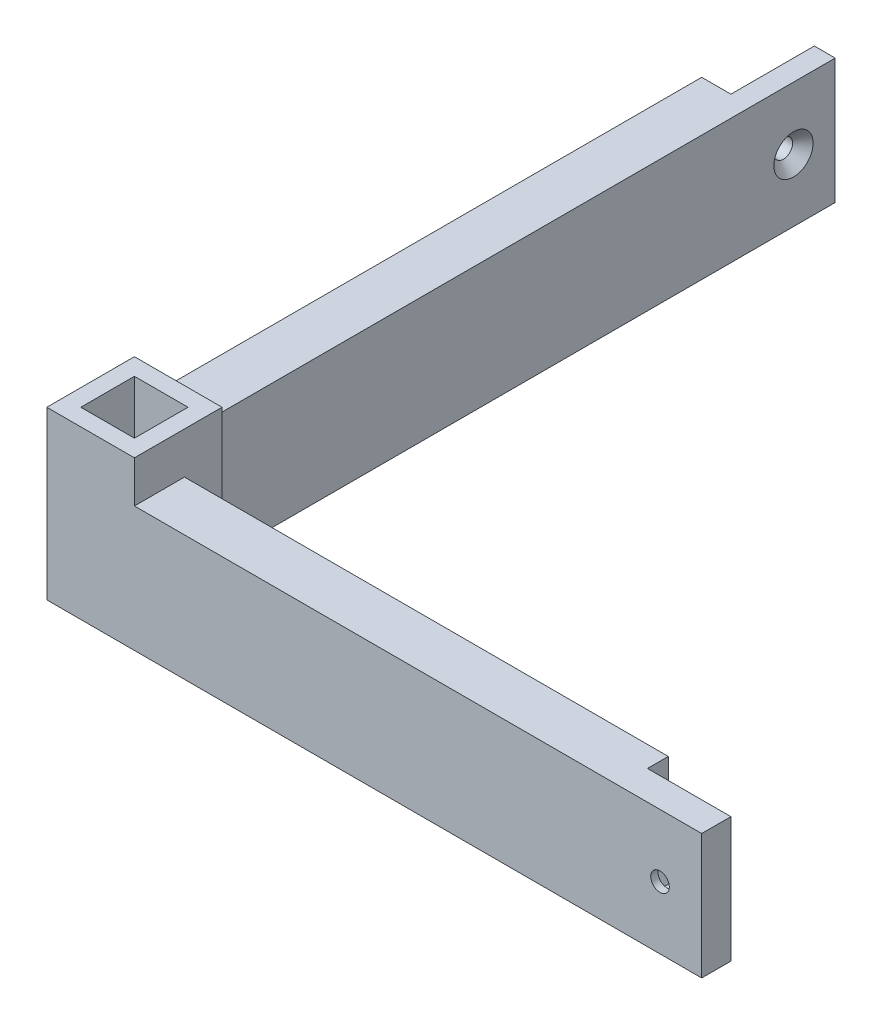
ISO-10303-21;
HEADER;
FILE_DESCRIPTION(('STEP AP214'),'2;1');
FILE_NAME('part.step','',(''),(''),'','','');
FILE_SCHEMA(('AUTOMOTIVE_DESIGN { 1 0 10303 214 1 1 1 1 }'));
ENDSEC;
DATA;
#1=APPLICATION_CONTEXT('core data for automotive mechanical design processes');
#2=APPLICATION_PROTOCOL_DEFINITION('international standard','automotive_design',2000,#1);
#3=PRODUCT_CONTEXT('',#1,'mechanical');
#4=PRODUCT('Part','Part','',(#3));
#5=PRODUCT_RELATED_PRODUCT_CATEGORY('part','',(#4));
#6=PRODUCT_DEFINITION_FORMATION('','',#4);
#7=PRODUCT_DEFINITION_CONTEXT('part definition',#1,'design');
#8=PRODUCT_DEFINITION('design','',#6,#7);
#9=PRODUCT_DEFINITION_SHAPE('','',#8);
#10=(LENGTH_UNIT() NAMED_UNIT(*) SI_UNIT(.MILLI.,.METRE.));
#11=(NAMED_UNIT(*) PLANE_ANGLE_UNIT() SI_UNIT($,.RADIAN.));
#12=(NAMED_UNIT(*) SI_UNIT($,.STERADIAN.) SOLID_ANGLE_UNIT());
#13=UNCERTAINTY_MEASURE_WITH_UNIT(LENGTH_MEASURE(1.E-05),#10,'distance_accuracy_value','');
#14=(GEOMETRIC_REPRESENTATION_CONTEXT(3) GLOBAL_UNCERTAINTY_ASSIGNED_CONTEXT((#13)) GLOBAL_UNIT_ASSIGNED_CONTEXT((#10,
#11,#12)) REPRESENTATION_CONTEXT('',''));
#15=CARTESIAN_POINT('',(0.,0.,0.));
#16=DIRECTION('',(0.,0.,1.));
#17=DIRECTION('',(1.,0.,0.));
#18=AXIS2_PLACEMENT_3D('',#15,#16,#17);
#19=CARTESIAN_POINT('',(21.,23.9944690265487,-13.3513274336283));
#20=DIRECTION('',(0.,0.,1.));
#21=DIRECTION('',(0.,-1.,0.));
#22=AXIS2_PLACEMENT_3D('',#19,#20,#21);
#23=PLANE('',#22);
#24=DIRECTION('',(-1.,0.,0.));
#25=VECTOR('',#24,1.);
#26=CARTESIAN_POINT('',(12.,-8.00553097345133,-13.3513274336283));
#27=LINE('',#26,#25);
#28=CARTESIAN_POINT('',(21.,-8.00553097345133,-13.3513274336283));
#29=VERTEX_POINT('',#28);
#30=CARTESIAN_POINT('',(12.,-8.00553097345133,-13.3513274336283));
#31=VERTEX_POINT('',#30);
#32=EDGE_CURVE('E264',#29,#31,#27,.T.);
#33=ORIENTED_EDGE('',*,*,#32,.T.);
#34=DIRECTION('',(0.,-1.,0.));
#35=VECTOR('',#34,1.);
#36=CARTESIAN_POINT('',(12.,-16.0055309734513,-13.3513274336283));
#37=LINE('',#36,#35);
#38=CARTESIAN_POINT('',(12.,13.9944690265487,-13.3513274336283));
#39=VERTEX_POINT('',#38);
#40=EDGE_CURVE('E435',#39,#31,#37,.T.);
#41=ORIENTED_EDGE('',*,*,#40,.F.);
#42=DIRECTION('',(1.,0.,0.));
#43=VECTOR('',#42,1.);
#44=CARTESIAN_POINT('',(0.,13.9944690265487,-13.3513274336283));
#45=LINE('',#44,#43);
#46=CARTESIAN_POINT('',(0.,13.9944690265487,-13.3513274336283));
#47=VERTEX_POINT('',#46);
#48=EDGE_CURVE('E430',#47,#39,#45,.T.);
#49=ORIENTED_EDGE('',*,*,#48,.F.);
#50=DIRECTION('',(0.,1.,0.));
#51=VECTOR('',#50,1.);
#52=CARTESIAN_POINT('',(0.,23.9944690265487,-13.3513274336283));
#53=LINE('',#52,#51);
#54=CARTESIAN_POINT('',(0.,23.9944690265487,-13.3513274336283));
#55=VERTEX_POINT('',#54);
#56=EDGE_CURVE('E522',#47,#55,#53,.T.);
#57=ORIENTED_EDGE('',*,*,#56,.T.);
#58=DIRECTION('',(-1.,0.,0.));
#59=VECTOR('',#58,1.);
#60=CARTESIAN_POINT('',(21.,23.9944690265487,-13.3513274336283));
#61=LINE('',#60,#59);
#62=CARTESIAN_POINT('',(21.,23.9944690265487,-13.3513274336283));
#63=VERTEX_POINT('',#62);
#64=EDGE_CURVE('E57',#63,#55,#61,.T.);
#65=ORIENTED_EDGE('',*,*,#64,.F.);
#66=DIRECTION('',(0.,1.,0.));
#67=VECTOR('',#66,1.);
#68=CARTESIAN_POINT('',(21.,23.9944690265487,-13.3513274336283));
#69=LINE('',#68,#67);
#70=EDGE_CURVE('E507',#29,#63,#69,.T.);
#71=ORIENTED_EDGE('',*,*,#70,.F.);
#72=EDGE_LOOP('',(#33,#41,#49,#57,#65,#71));
#73=FACE_BOUND('',#72,.T.);
#74=ADVANCED_FACE('F47',(#73),#23,.F.);
#75=CARTESIAN_POINT('',(0.,0.,0.));
#76=DIRECTION('',(1.,0.,0.));
#77=DIRECTION('',(0.,0.,-1.));
#78=AXIS2_PLACEMENT_3D('',#75,#76,#77);
#79=PLANE('',#78);
#80=DIRECTION('',(0.,1.,0.));
#81=VECTOR('',#80,1.);
#82=CARTESIAN_POINT('',(0.,13.9944690265487,-149.351327433628));
#83=LINE('',#82,#81);
#84=CARTESIAN_POINT('',(0.,-16.0055309734513,-149.351327433628));
#85=VERTEX_POINT('',#84);
#86=CARTESIAN_POINT('',(0.,13.9944690265487,-149.351327433628));
#87=VERTEX_POINT('',#86);
#88=EDGE_CURVE('E383',#85,#87,#83,.T.);
#89=ORIENTED_EDGE('',*,*,#88,.F.);
#90=DIRECTION('',(0.,0.,-1.));
#91=VECTOR('',#90,1.);
#92=CARTESIAN_POINT('',(0.,-16.0055309734513,7.64867256637168));
#93=LINE('',#92,#91);
#94=CARTESIAN_POINT('',(0.,-16.0055309734513,7.64867256637168));
#95=VERTEX_POINT('',#94);
#96=EDGE_CURVE('E518',#95,#85,#93,.T.);
#97=ORIENTED_EDGE('',*,*,#96,.F.);
#98=DIRECTION('',(0.,-1.,0.));
#99=VECTOR('',#98,1.);
#100=CARTESIAN_POINT('',(0.,23.9944690265487,7.64867256637168));
#101=LINE('',#100,#99);
#102=CARTESIAN_POINT('',(0.,23.9944690265487,7.64867256637168));
#103=VERTEX_POINT('',#102);
#104=EDGE_CURVE('E494',#103,#95,#101,.T.);
#105=ORIENTED_EDGE('',*,*,#104,.F.);
#106=DIRECTION('',(0.,0.,1.));
#107=VECTOR('',#106,1.);
#108=CARTESIAN_POINT('',(0.,23.9944690265487,7.64867256637168));
#109=LINE('',#108,#107);
#110=EDGE_CURVE('E508',#55,#103,#109,.T.);
#111=ORIENTED_EDGE('',*,*,#110,.F.);
#112=ORIENTED_EDGE('',*,*,#56,.F.);
#113=DIRECTION('',(0.,0.,1.));
#114=VECTOR('',#113,1.);
#115=CARTESIAN_POINT('',(0.,13.9944690265487,-169.351327433628));
#116=LINE('',#115,#114);
#117=EDGE_CURVE('E456',#87,#47,#116,.T.);
#118=ORIENTED_EDGE('',*,*,#117,.F.);
#119=EDGE_LOOP('',(#89,#97,#105,#111,#112,#118));
#120=FACE_BOUND('',#119,.T.);
#121=ADVANCED_FACE('F557',(#120),#79,.F.);
#122=CARTESIAN_POINT('',(137.,0.,0.));
#123=DIRECTION('',(-1.,0.,0.));
#124=DIRECTION('',(0.,0.,1.));
#125=AXIS2_PLACEMENT_3D('',#122,#123,#124);
#126=PLANE('',#125);
#127=DIRECTION('',(0.,0.,1.));
#128=VECTOR('',#127,1.);
#129=CARTESIAN_POINT('',(137.,13.9944690265487,7.64867256637169));
#130=LINE('',#129,#128);
#131=CARTESIAN_POINT('',(137.,13.9944690265487,-4.35132743362831));
#132=VERTEX_POINT('',#131);
#133=CARTESIAN_POINT('',(137.,13.9944690265487,0.648672566371685));
#134=VERTEX_POINT('',#133);
#135=EDGE_CURVE('E410',#132,#134,#130,.T.);
#136=ORIENTED_EDGE('',*,*,#135,.T.);
#137=DIRECTION('',(0.,1.,0.));
#138=VECTOR('',#137,1.);
#139=CARTESIAN_POINT('',(137.,13.9944690265487,0.648672566371685));
#140=LINE('',#139,#138);
#141=CARTESIAN_POINT('',(137.,-16.0055309734513,0.648672566371685));
#142=VERTEX_POINT('',#141);
#143=EDGE_CURVE('E245',#142,#134,#140,.T.);
#144=ORIENTED_EDGE('',*,*,#143,.F.);
#145=DIRECTION('',(0.,0.,-1.));
#146=VECTOR('',#145,1.);
#147=CARTESIAN_POINT('',(137.,-16.0055309734513,7.64867256637168));
#148=LINE('',#147,#146);
#149=CARTESIAN_POINT('',(137.,-16.0055309734513,-4.35132743362831));
#150=VERTEX_POINT('',#149);
#151=EDGE_CURVE('E241',#142,#150,#148,.T.);
#152=ORIENTED_EDGE('',*,*,#151,.T.);
#153=DIRECTION('',(0.,1.,0.));
#154=VECTOR('',#153,1.);
#155=CARTESIAN_POINT('',(137.,-16.0055309734513,-4.35132743362831));
#156=LINE('',#155,#154);
#157=EDGE_CURVE('E406',#150,#132,#156,.T.);
#158=ORIENTED_EDGE('',*,*,#157,.T.);
#159=EDGE_LOOP('',(#136,#144,#152,#158));
#160=FACE_BOUND('',#159,.T.);
#161=ADVANCED_FACE('F565',(#160),#126,.F.);
#162=CARTESIAN_POINT('',(21.,23.9944690265487,7.64867256637168));
#163=DIRECTION('',(0.,0.,-1.));
#164=DIRECTION('',(-1.,0.,0.));
#165=AXIS2_PLACEMENT_3D('',#162,#163,#164);
#166=PLANE('',#165);
#167=CARTESIAN_POINT('',(147.,-1.0055309734513,7.64867256637168));
#168=DIRECTION('',(0.,0.,-1.));
#169=DIRECTION('',(-1.,0.,0.));
#170=AXIS2_PLACEMENT_3D('',#167,#168,#169);
#171=CIRCLE('',#170,2.22693383356891);
#172=CARTESIAN_POINT('',(144.773066166431,-1.0055309734513,7.64867256637168));
#173=VERTEX_POINT('',#172);
#174=EDGE_CURVE('E252',#173,#173,#171,.T.);
#175=ORIENTED_EDGE('',*,*,#174,.T.);
#176=EDGE_LOOP('',(#175));
#177=FACE_BOUND('',#176,.T.);
#178=ORIENTED_EDGE('',*,*,#104,.T.);
#179=DIRECTION('',(-1.,0.,0.));
#180=VECTOR('',#179,1.);
#181=CARTESIAN_POINT('',(21.,-16.0055309734513,7.64867256637168));
#182=LINE('',#181,#180);
#183=CARTESIAN_POINT('',(157.,-16.0055309734513,7.64867256637168));
#184=VERTEX_POINT('',#183);
#185=EDGE_CURVE('E11',#184,#95,#182,.T.);
#186=ORIENTED_EDGE('',*,*,#185,.F.);
#187=DIRECTION('',(0.,-1.,0.));
#188=VECTOR('',#187,1.);
#189=CARTESIAN_POINT('',(157.,13.9944690265487,7.64867256637168));
#190=LINE('',#189,#188);
#191=CARTESIAN_POINT('',(157.,13.9944690265487,7.64867256637168));
#192=VERTEX_POINT('',#191);
#193=EDGE_CURVE('E231',#192,#184,#190,.T.);
#194=ORIENTED_EDGE('',*,*,#193,.F.);
#195=DIRECTION('',(-1.,0.,0.));
#196=VECTOR('',#195,1.);
#197=CARTESIAN_POINT('',(137.,13.9944690265487,7.64867256637169));
#198=LINE('',#197,#196);
#199=CARTESIAN_POINT('',(21.,13.9944690265487,7.64867256637168));
#200=VERTEX_POINT('',#199);
#201=EDGE_CURVE('E414',#192,#200,#198,.T.);
#202=ORIENTED_EDGE('',*,*,#201,.T.);
#203=DIRECTION('',(0.,-1.,0.));
#204=VECTOR('',#203,1.);
#205=CARTESIAN_POINT('',(21.,23.9944690265487,7.64867256637168));
#206=LINE('',#205,#204);
#207=CARTESIAN_POINT('',(21.,23.9944690265487,7.64867256637168));
#208=VERTEX_POINT('',#207);
#209=EDGE_CURVE('E504',#208,#200,#206,.T.);
#210=ORIENTED_EDGE('',*,*,#209,.F.);
#211=DIRECTION('',(-1.,0.,0.));
#212=VECTOR('',#211,1.);
#213=CARTESIAN_POINT('',(21.,23.9944690265487,7.64867256637168));
#214=LINE('',#213,#212);
#215=EDGE_CURVE('E514',#208,#103,#214,.T.);
#216=ORIENTED_EDGE('',*,*,#215,.T.);
#217=EDGE_LOOP('',(#178,#186,#194,#202,#210,#216));
#218=FACE_BOUND('',#217,.T.);
#219=ADVANCED_FACE('F49',(#177,#218),#166,.F.);
#220=CARTESIAN_POINT('',(21.,-16.0055309734513,7.64867256637168));
#221=DIRECTION('',(0.,1.,0.));
#222=DIRECTION('',(0.,0.,1.));
#223=AXIS2_PLACEMENT_3D('',#220,#221,#222);
#224=PLANE('',#223);
#225=ORIENTED_EDGE('',*,*,#151,.F.);
#226=DIRECTION('',(-1.,0.,0.));
#227=VECTOR('',#226,1.);
#228=CARTESIAN_POINT('',(157.,-16.0055309734513,0.648672566371685));
#229=LINE('',#228,#227);
#230=CARTESIAN_POINT('',(157.,-16.0055309734513,0.648672566371685));
#231=VERTEX_POINT('',#230);
#232=EDGE_CURVE('E237',#231,#142,#229,.T.);
#233=ORIENTED_EDGE('',*,*,#232,.F.);
#234=DIRECTION('',(0.,0.,-1.));
#235=VECTOR('',#234,1.);
#236=CARTESIAN_POINT('',(157.,-16.0055309734513,1.64867256637169));
#237=LINE('',#236,#235);
#238=EDGE_CURVE('E224',#184,#231,#237,.T.);
#239=ORIENTED_EDGE('',*,*,#238,.F.);
#240=ORIENTED_EDGE('',*,*,#185,.T.);
#241=ORIENTED_EDGE('',*,*,#96,.T.);
#242=DIRECTION('',(-1.,0.,0.));
#243=VECTOR('',#242,1.);
#244=CARTESIAN_POINT('',(7.,-16.0055309734513,-149.351327433628));
#245=LINE('',#244,#243);
#246=CARTESIAN_POINT('',(7.,-16.0055309734513,-149.351327433628));
#247=VERTEX_POINT('',#246);
#248=EDGE_CURVE('E380',#247,#85,#245,.T.);
#249=ORIENTED_EDGE('',*,*,#248,.F.);
#250=DIRECTION('',(0.,0.,-1.));
#251=VECTOR('',#250,1.);
#252=CARTESIAN_POINT('',(7.,-16.0055309734513,-149.351327433628));
#253=LINE('',#252,#251);
#254=CARTESIAN_POINT('',(7.,-16.0055309734513,-169.351327433628));
#255=VERTEX_POINT('',#254);
#256=EDGE_CURVE('E390',#247,#255,#253,.T.);
#257=ORIENTED_EDGE('',*,*,#256,.T.);
#258=DIRECTION('',(-1.,0.,0.));
#259=VECTOR('',#258,1.);
#260=CARTESIAN_POINT('',(0.,-16.0055309734513,-169.351327433628));
#261=LINE('',#260,#259);
#262=CARTESIAN_POINT('',(12.,-16.0055309734513,-169.351327433628));
#263=VERTEX_POINT('',#262);
#264=EDGE_CURVE('E438',#263,#255,#261,.T.);
#265=ORIENTED_EDGE('',*,*,#264,.F.);
#266=DIRECTION('',(0.,0.,1.));
#267=VECTOR('',#266,1.);
#268=CARTESIAN_POINT('',(12.,-16.0055309734513,-169.351327433628));
#269=LINE('',#268,#267);
#270=CARTESIAN_POINT('',(12.,-16.0055309734513,-22.3513274336284));
#271=VERTEX_POINT('',#270);
#272=EDGE_CURVE('E442',#263,#271,#269,.T.);
#273=ORIENTED_EDGE('',*,*,#272,.T.);
#274=DIRECTION('',(0.707106781186543,0.,0.707106781186552));
#275=VECTOR('',#274,1.);
#276=CARTESIAN_POINT('',(21.,-16.0055309734513,-13.3513274336283));
#277=LINE('',#276,#275);
#278=CARTESIAN_POINT('',(29.9999999999999,-16.0055309734513,-4.35132743362831));
#279=VERTEX_POINT('',#278);
#280=EDGE_CURVE('E278',#271,#279,#277,.T.);
#281=ORIENTED_EDGE('',*,*,#280,.T.);
#282=DIRECTION('',(-1.,0.,0.));
#283=VECTOR('',#282,1.);
#284=CARTESIAN_POINT('',(137.,-16.0055309734513,-4.35132743362831));
#285=LINE('',#284,#283);
#286=EDGE_CURVE('E427',#150,#279,#285,.T.);
#287=ORIENTED_EDGE('',*,*,#286,.F.);
#288=EDGE_LOOP('',(#225,#233,#239,#240,#241,#249,#257,#265,#273,#281,#287));
#289=FACE_BOUND('',#288,.T.);
#290=DIRECTION('',(1.,0.,0.));
#291=VECTOR('',#290,1.);
#292=CARTESIAN_POINT('',(4.075,-16.0055309734513,3.57367256637168));
#293=LINE('',#292,#291);
#294=CARTESIAN_POINT('',(4.075,-16.0055309734513,3.57367256637168));
#295=VERTEX_POINT('',#294);
#296=CARTESIAN_POINT('',(16.925,-16.0055309734513,3.57367256637168));
#297=VERTEX_POINT('',#296);
#298=EDGE_CURVE('E473',#295,#297,#293,.T.);
#299=ORIENTED_EDGE('',*,*,#298,.T.);
#300=DIRECTION('',(0.,0.,-1.));
#301=VECTOR('',#300,1.);
#302=CARTESIAN_POINT('',(16.925,-16.0055309734513,3.57367256637168));
#303=LINE('',#302,#301);
#304=CARTESIAN_POINT('',(16.925,-16.0055309734513,-9.27632743362832));
#305=VERTEX_POINT('',#304);
#306=EDGE_CURVE('E460',#297,#305,#303,.T.);
#307=ORIENTED_EDGE('',*,*,#306,.T.);
#308=DIRECTION('',(-1.,0.,0.));
#309=VECTOR('',#308,1.);
#310=CARTESIAN_POINT('',(4.075,-16.0055309734513,-9.27632743362832));
#311=LINE('',#310,#309);
#312=CARTESIAN_POINT('',(4.075,-16.0055309734513,-9.27632743362832));
#313=VERTEX_POINT('',#312);
#314=EDGE_CURVE('E464',#305,#313,#311,.T.);
#315=ORIENTED_EDGE('',*,*,#314,.T.);
#316=DIRECTION('',(0.,0.,1.));
#317=VECTOR('',#316,1.);
#318=CARTESIAN_POINT('',(4.075,-16.0055309734513,3.57367256637168));
#319=LINE('',#318,#317);
#320=EDGE_CURVE('E469',#313,#295,#319,.T.);
#321=ORIENTED_EDGE('',*,*,#320,.T.);
#322=EDGE_LOOP('',(#299,#307,#315,#321));
#323=FACE_BOUND('',#322,.T.);
#324=ADVANCED_FACE('F238',(#289,#323),#224,.F.);
#325=CARTESIAN_POINT('',(21.,23.9944690265487,7.64867256637168));
#326=DIRECTION('',(0.,-1.,0.));
#327=DIRECTION('',(0.,0.,-1.));
#328=AXIS2_PLACEMENT_3D('',#325,#326,#327);
#329=PLANE('',#328);
#330=DIRECTION('',(-1.,0.,0.));
#331=VECTOR('',#330,1.);
#332=CARTESIAN_POINT('',(4.075,23.9944690265487,-9.27632743362832));
#333=LINE('',#332,#331);
#334=CARTESIAN_POINT('',(16.925,23.9944690265487,-9.27632743362831));
#335=VERTEX_POINT('',#334);
#336=CARTESIAN_POINT('',(4.075,23.9944690265487,-9.27632743362832));
#337=VERTEX_POINT('',#336);
#338=EDGE_CURVE('E480',#335,#337,#333,.T.);
#339=ORIENTED_EDGE('',*,*,#338,.F.);
#340=DIRECTION('',(0.,0.,-1.));
#341=VECTOR('',#340,1.);
#342=CARTESIAN_POINT('',(16.925,23.9944690265487,3.57367256637168));
#343=LINE('',#342,#341);
#344=CARTESIAN_POINT('',(16.925,23.9944690265487,3.57367256637168));
#345=VERTEX_POINT('',#344);
#346=EDGE_CURVE('E459',#345,#335,#343,.T.);
#347=ORIENTED_EDGE('',*,*,#346,.F.);
#348=DIRECTION('',(1.,0.,0.));
#349=VECTOR('',#348,1.);
#350=CARTESIAN_POINT('',(4.075,23.9944690265487,3.57367256637168));
#351=LINE('',#350,#349);
#352=CARTESIAN_POINT('',(4.075,23.9944690265487,3.57367256637168));
#353=VERTEX_POINT('',#352);
#354=EDGE_CURVE('E465',#353,#345,#351,.T.);
#355=ORIENTED_EDGE('',*,*,#354,.F.);
#356=DIRECTION('',(0.,0.,1.));
#357=VECTOR('',#356,1.);
#358=CARTESIAN_POINT('',(4.075,23.9944690265487,3.57367256637168));
#359=LINE('',#358,#357);
#360=EDGE_CURVE('E484',#337,#353,#359,.T.);
#361=ORIENTED_EDGE('',*,*,#360,.F.);
#362=EDGE_LOOP('',(#339,#347,#355,#361));
#363=FACE_BOUND('',#362,.T.);
#364=ORIENTED_EDGE('',*,*,#110,.T.);
#365=ORIENTED_EDGE('',*,*,#215,.F.);
#366=DIRECTION('',(0.,0.,1.));
#367=VECTOR('',#366,1.);
#368=CARTESIAN_POINT('',(21.,23.9944690265487,7.64867256637168));
#369=LINE('',#368,#367);
#370=EDGE_CURVE('E511',#63,#208,#369,.T.);
#371=ORIENTED_EDGE('',*,*,#370,.F.);
#372=ORIENTED_EDGE('',*,*,#64,.T.);
#373=EDGE_LOOP('',(#364,#365,#371,#372));
#374=FACE_BOUND('',#373,.T.);
#375=ADVANCED_FACE('F569',(#363,#374),#329,.F.);
#376=CARTESIAN_POINT('',(21.,0.,0.));
#377=DIRECTION('',(1.,0.,0.));
#378=DIRECTION('',(0.,0.,-1.));
#379=AXIS2_PLACEMENT_3D('',#376,#377,#378);
#380=PLANE('',#379);
#381=DIRECTION('',(0.,0.,-1.));
#382=VECTOR('',#381,1.);
#383=CARTESIAN_POINT('',(21.,-8.00553097345133,-4.35132743362831));
#384=LINE('',#383,#382);
#385=CARTESIAN_POINT('',(21.,-8.00553097345133,-4.35132743362831));
#386=VERTEX_POINT('',#385);
#387=EDGE_CURVE('E279',#386,#29,#384,.T.);
#388=ORIENTED_EDGE('',*,*,#387,.T.);
#389=ORIENTED_EDGE('',*,*,#70,.T.);
#390=ORIENTED_EDGE('',*,*,#370,.T.);
#391=ORIENTED_EDGE('',*,*,#209,.T.);
#392=DIRECTION('',(0.,0.,1.));
#393=VECTOR('',#392,1.);
#394=CARTESIAN_POINT('',(21.,13.9944690265487,7.64867256637169));
#395=LINE('',#394,#393);
#396=CARTESIAN_POINT('',(21.,13.9944690265487,-4.35132743362831));
#397=VERTEX_POINT('',#396);
#398=EDGE_CURVE('E407',#397,#200,#395,.T.);
#399=ORIENTED_EDGE('',*,*,#398,.F.);
#400=DIRECTION('',(0.,1.,0.));
#401=VECTOR('',#400,1.);
#402=CARTESIAN_POINT('',(21.,-16.0055309734513,-4.35132743362831));
#403=LINE('',#402,#401);
#404=EDGE_CURVE('E234',#386,#397,#403,.T.);
#405=ORIENTED_EDGE('',*,*,#404,.F.);
#406=EDGE_LOOP('',(#388,#389,#390,#391,#399,#405));
#407=FACE_BOUND('',#406,.T.);
#408=ADVANCED_FACE('F576',(#407),#380,.T.);
#409=CARTESIAN_POINT('',(16.925,-16.0055309734513,3.57367256637168));
#410=DIRECTION('',(1.,0.,0.));
#411=DIRECTION('',(0.,0.,-1.));
#412=AXIS2_PLACEMENT_3D('',#409,#410,#411);
#413=PLANE('',#412);
#414=ORIENTED_EDGE('',*,*,#346,.T.);
#415=DIRECTION('',(0.,1.,0.));
#416=VECTOR('',#415,1.);
#417=CARTESIAN_POINT('',(16.925,-16.0055309734513,-9.27632743362832));
#418=LINE('',#417,#416);
#419=EDGE_CURVE('E477',#305,#335,#418,.T.);
#420=ORIENTED_EDGE('',*,*,#419,.F.);
#421=ORIENTED_EDGE('',*,*,#306,.F.);
#422=DIRECTION('',(0.,1.,0.));
#423=VECTOR('',#422,1.);
#424=CARTESIAN_POINT('',(16.925,-16.0055309734513,3.57367256637168));
#425=LINE('',#424,#423);
#426=EDGE_CURVE('E491',#297,#345,#425,.T.);
#427=ORIENTED_EDGE('',*,*,#426,.T.);
#428=EDGE_LOOP('',(#414,#420,#421,#427));
#429=FACE_BOUND('',#428,.T.);
#430=ADVANCED_FACE('F645',(#429),#413,.F.);
#431=CARTESIAN_POINT('',(4.075,-16.0055309734513,3.57367256637168));
#432=DIRECTION('',(0.,0.,1.));
#433=DIRECTION('',(1.,0.,0.));
#434=AXIS2_PLACEMENT_3D('',#431,#432,#433);
#435=PLANE('',#434);
#436=ORIENTED_EDGE('',*,*,#354,.T.);
#437=ORIENTED_EDGE('',*,*,#426,.F.);
#438=ORIENTED_EDGE('',*,*,#298,.F.);
#439=DIRECTION('',(0.,1.,0.));
#440=VECTOR('',#439,1.);
#441=CARTESIAN_POINT('',(4.075,-16.0055309734513,3.57367256637168));
#442=LINE('',#441,#440);
#443=EDGE_CURVE('E495',#295,#353,#442,.T.);
#444=ORIENTED_EDGE('',*,*,#443,.T.);
#445=EDGE_LOOP('',(#436,#437,#438,#444));
#446=FACE_BOUND('',#445,.T.);
#447=ADVANCED_FACE('F641',(#446),#435,.F.);
#448=CARTESIAN_POINT('',(4.075,-16.0055309734513,3.57367256637168));
#449=DIRECTION('',(-1.,0.,0.));
#450=DIRECTION('',(0.,0.,1.));
#451=AXIS2_PLACEMENT_3D('',#448,#449,#450);
#452=PLANE('',#451);
#453=ORIENTED_EDGE('',*,*,#360,.T.);
#454=ORIENTED_EDGE('',*,*,#443,.F.);
#455=ORIENTED_EDGE('',*,*,#320,.F.);
#456=DIRECTION('',(0.,1.,0.));
#457=VECTOR('',#456,1.);
#458=CARTESIAN_POINT('',(4.075,-16.0055309734513,-9.27632743362832));
#459=LINE('',#458,#457);
#460=EDGE_CURVE('E498',#313,#337,#459,.T.);
#461=ORIENTED_EDGE('',*,*,#460,.T.);
#462=EDGE_LOOP('',(#453,#454,#455,#461));
#463=FACE_BOUND('',#462,.T.);
#464=ADVANCED_FACE('F644',(#463),#452,.F.);
#465=CARTESIAN_POINT('',(4.075,-16.0055309734513,-9.27632743362832));
#466=DIRECTION('',(0.,0.,-1.));
#467=DIRECTION('',(-1.,0.,0.));
#468=AXIS2_PLACEMENT_3D('',#465,#466,#467);
#469=PLANE('',#468);
#470=ORIENTED_EDGE('',*,*,#338,.T.);
#471=ORIENTED_EDGE('',*,*,#460,.F.);
#472=ORIENTED_EDGE('',*,*,#314,.F.);
#473=ORIENTED_EDGE('',*,*,#419,.T.);
#474=EDGE_LOOP('',(#470,#471,#472,#473));
#475=FACE_BOUND('',#474,.T.);
#476=ADVANCED_FACE('F640',(#475),#469,.F.);
#477=CARTESIAN_POINT('',(0.,13.9944690265487,-169.351327433628));
#478=DIRECTION('',(0.,-1.,0.));
#479=DIRECTION('',(1.,0.,0.));
#480=AXIS2_PLACEMENT_3D('',#477,#478,#479);
#481=PLANE('',#480);
#482=DIRECTION('',(1.,0.,0.));
#483=VECTOR('',#482,1.);
#484=CARTESIAN_POINT('',(0.,13.9944690265487,-169.351327433628));
#485=LINE('',#484,#483);
#486=CARTESIAN_POINT('',(7.,13.9944690265487,-169.351327433628));
#487=VERTEX_POINT('',#486);
#488=CARTESIAN_POINT('',(12.,13.9944690265487,-169.351327433628));
#489=VERTEX_POINT('',#488);
#490=EDGE_CURVE('E431',#487,#489,#485,.T.);
#491=ORIENTED_EDGE('',*,*,#490,.F.);
#492=DIRECTION('',(0.,0.,-1.));
#493=VECTOR('',#492,1.);
#494=CARTESIAN_POINT('',(7.,13.9944690265487,-149.351327433628));
#495=LINE('',#494,#493);
#496=CARTESIAN_POINT('',(7.,13.9944690265487,-149.351327433628));
#497=VERTEX_POINT('',#496);
#498=EDGE_CURVE('E393',#497,#487,#495,.T.);
#499=ORIENTED_EDGE('',*,*,#498,.F.);
#500=DIRECTION('',(1.,0.,0.));
#501=VECTOR('',#500,1.);
#502=CARTESIAN_POINT('',(7.,13.9944690265487,-149.351327433628));
#503=LINE('',#502,#501);
#504=EDGE_CURVE('E386',#87,#497,#503,.T.);
#505=ORIENTED_EDGE('',*,*,#504,.F.);
#506=ORIENTED_EDGE('',*,*,#117,.T.);
#507=ORIENTED_EDGE('',*,*,#48,.T.);
#508=DIRECTION('',(0.,0.,1.));
#509=VECTOR('',#508,1.);
#510=CARTESIAN_POINT('',(12.,13.9944690265487,-169.351327433628));
#511=LINE('',#510,#509);
#512=EDGE_CURVE('E452',#489,#39,#511,.T.);
#513=ORIENTED_EDGE('',*,*,#512,.F.);
#514=EDGE_LOOP('',(#491,#499,#505,#506,#507,#513));
#515=FACE_BOUND('',#514,.T.);
#516=ADVANCED_FACE('F605',(#515),#481,.F.);
#517=CARTESIAN_POINT('',(12.,-16.0055309734513,-169.351327433628));
#518=DIRECTION('',(-1.,0.,0.));
#519=DIRECTION('',(0.,-1.,0.));
#520=AXIS2_PLACEMENT_3D('',#517,#518,#519);
#521=PLANE('',#520);
#522=CARTESIAN_POINT('',(12.,-1.00553097345134,-159.351327433628));
#523=DIRECTION('',(1.,0.,0.));
#524=DIRECTION('',(0.,0.,-1.));
#525=AXIS2_PLACEMENT_3D('',#522,#523,#524);
#526=CIRCLE('',#525,4.7);
#527=CARTESIAN_POINT('',(12.,-1.00553097345134,-164.051327433628));
#528=VERTEX_POINT('',#527);
#529=EDGE_CURVE('E294',#528,#528,#526,.T.);
#530=ORIENTED_EDGE('',*,*,#529,.F.);
#531=EDGE_LOOP('',(#530));
#532=FACE_BOUND('',#531,.T.);
#533=DIRECTION('',(0.,0.,-1.));
#534=VECTOR('',#533,1.);
#535=CARTESIAN_POINT('',(12.,-8.00553097345133,-22.3513274336284));
#536=LINE('',#535,#534);
#537=CARTESIAN_POINT('',(12.,-8.00553097345133,-22.3513274336284));
#538=VERTEX_POINT('',#537);
#539=EDGE_CURVE('E268',#31,#538,#536,.T.);
#540=ORIENTED_EDGE('',*,*,#539,.T.);
#541=DIRECTION('',(0.,-1.,0.));
#542=VECTOR('',#541,1.);
#543=CARTESIAN_POINT('',(12.,-8.00553097345133,-22.3513274336284));
#544=LINE('',#543,#542);
#545=EDGE_CURVE('E274',#538,#271,#544,.T.);
#546=ORIENTED_EDGE('',*,*,#545,.T.);
#547=ORIENTED_EDGE('',*,*,#272,.F.);
#548=DIRECTION('',(0.,-1.,0.));
#549=VECTOR('',#548,1.);
#550=CARTESIAN_POINT('',(12.,-16.0055309734513,-169.351327433628));
#551=LINE('',#550,#549);
#552=EDGE_CURVE('E434',#489,#263,#551,.T.);
#553=ORIENTED_EDGE('',*,*,#552,.F.);
#554=ORIENTED_EDGE('',*,*,#512,.T.);
#555=ORIENTED_EDGE('',*,*,#40,.T.);
#556=EDGE_LOOP('',(#540,#546,#547,#553,#554,#555));
#557=FACE_BOUND('',#556,.T.);
#558=ADVANCED_FACE('F610',(#532,#557),#521,.F.);
#559=CARTESIAN_POINT('',(0.,0.,-169.351327433628));
#560=DIRECTION('',(0.,0.,-1.));
#561=DIRECTION('',(-1.,0.,0.));
#562=AXIS2_PLACEMENT_3D('',#559,#560,#561);
#563=PLANE('',#562);
#564=DIRECTION('',(0.,-1.,0.));
#565=VECTOR('',#564,1.);
#566=CARTESIAN_POINT('',(7.,13.9944690265487,-169.351327433628));
#567=LINE('',#566,#565);
#568=EDGE_CURVE('E356',#487,#255,#567,.T.);
#569=ORIENTED_EDGE('',*,*,#568,.F.);
#570=ORIENTED_EDGE('',*,*,#490,.T.);
#571=ORIENTED_EDGE('',*,*,#552,.T.);
#572=ORIENTED_EDGE('',*,*,#264,.T.);
#573=EDGE_LOOP('',(#569,#570,#571,#572));
#574=FACE_BOUND('',#573,.T.);
#575=ADVANCED_FACE('F602',(#574),#563,.T.);
#576=CARTESIAN_POINT('',(137.,-16.0055309734513,-4.35132743362831));
#577=DIRECTION('',(0.,0.,1.));
#578=DIRECTION('',(0.,-1.,0.));
#579=AXIS2_PLACEMENT_3D('',#576,#577,#578);
#580=PLANE('',#579);
#581=ORIENTED_EDGE('',*,*,#286,.T.);
#582=DIRECTION('',(0.,-1.,0.));
#583=VECTOR('',#582,1.);
#584=CARTESIAN_POINT('',(29.9999999999999,-8.00553097345133,-4.3513274336283));
#585=LINE('',#584,#583);
#586=CARTESIAN_POINT('',(29.9999999999999,-8.00553097345133,-4.35132743362831));
#587=VERTEX_POINT('',#586);
#588=EDGE_CURVE('E73',#587,#279,#585,.T.);
#589=ORIENTED_EDGE('',*,*,#588,.F.);
#590=DIRECTION('',(-1.,0.,0.));
#591=VECTOR('',#590,1.);
#592=CARTESIAN_POINT('',(29.9999999999999,-8.00553097345133,-4.3513274336283));
#593=LINE('',#592,#591);
#594=EDGE_CURVE('E286',#587,#386,#593,.T.);
#595=ORIENTED_EDGE('',*,*,#594,.T.);
#596=ORIENTED_EDGE('',*,*,#404,.T.);
#597=DIRECTION('',(-1.,0.,0.));
#598=VECTOR('',#597,1.);
#599=CARTESIAN_POINT('',(137.,13.9944690265487,-4.35132743362831));
#600=LINE('',#599,#598);
#601=EDGE_CURVE('E423',#132,#397,#600,.T.);
#602=ORIENTED_EDGE('',*,*,#601,.F.);
#603=ORIENTED_EDGE('',*,*,#157,.F.);
#604=EDGE_LOOP('',(#581,#589,#595,#596,#602,#603));
#605=FACE_BOUND('',#604,.T.);
#606=ADVANCED_FACE('F618',(#605),#580,.F.);
#607=CARTESIAN_POINT('',(137.,13.9944690265487,7.64867256637169));
#608=DIRECTION('',(0.,-1.,0.));
#609=DIRECTION('',(0.,0.,-1.));
#610=AXIS2_PLACEMENT_3D('',#607,#608,#609);
#611=PLANE('',#610);
#612=ORIENTED_EDGE('',*,*,#398,.T.);
#613=ORIENTED_EDGE('',*,*,#201,.F.);
#614=DIRECTION('',(0.,0.,1.));
#615=VECTOR('',#614,1.);
#616=CARTESIAN_POINT('',(157.,13.9944690265487,1.64867256637169));
#617=LINE('',#616,#615);
#618=CARTESIAN_POINT('',(157.,13.9944690265487,0.648672566371685));
#619=VERTEX_POINT('',#618);
#620=EDGE_CURVE('E396',#619,#192,#617,.T.);
#621=ORIENTED_EDGE('',*,*,#620,.F.);
#622=DIRECTION('',(1.,0.,0.));
#623=VECTOR('',#622,1.);
#624=CARTESIAN_POINT('',(157.,13.9944690265487,0.648672566371685));
#625=LINE('',#624,#623);
#626=EDGE_CURVE('E250',#134,#619,#625,.T.);
#627=ORIENTED_EDGE('',*,*,#626,.F.);
#628=ORIENTED_EDGE('',*,*,#135,.F.);
#629=ORIENTED_EDGE('',*,*,#601,.T.);
#630=EDGE_LOOP('',(#612,#613,#621,#627,#628,#629));
#631=FACE_BOUND('',#630,.T.);
#632=ADVANCED_FACE('F625',(#631),#611,.F.);
#633=CARTESIAN_POINT('',(157.,0.,0.));
#634=DIRECTION('',(-1.,0.,0.));
#635=DIRECTION('',(0.,0.,1.));
#636=AXIS2_PLACEMENT_3D('',#633,#634,#635);
#637=PLANE('',#636);
#638=ORIENTED_EDGE('',*,*,#238,.T.);
#639=DIRECTION('',(0.,-1.,0.));
#640=VECTOR('',#639,1.);
#641=CARTESIAN_POINT('',(157.,13.9944690265487,0.648672566371685));
#642=LINE('',#641,#640);
#643=EDGE_CURVE('E229',#619,#231,#642,.T.);
#644=ORIENTED_EDGE('',*,*,#643,.F.);
#645=ORIENTED_EDGE('',*,*,#620,.T.);
#646=ORIENTED_EDGE('',*,*,#193,.T.);
#647=EDGE_LOOP('',(#638,#644,#645,#646));
#648=FACE_BOUND('',#647,.T.);
#649=ADVANCED_FACE('F226',(#648),#637,.F.);
#650=CARTESIAN_POINT('',(7.,13.9944690265487,-149.351327433628));
#651=DIRECTION('',(1.,0.,0.));
#652=DIRECTION('',(0.,1.,0.));
#653=AXIS2_PLACEMENT_3D('',#650,#651,#652);
#654=PLANE('',#653);
#655=CARTESIAN_POINT('',(7.,-1.00553097345134,-159.351327433628));
#656=DIRECTION('',(1.,0.,0.));
#657=DIRECTION('',(0.,1.,0.));
#658=AXIS2_PLACEMENT_3D('',#655,#656,#657);
#659=CIRCLE('',#658,2.25);
#660=CARTESIAN_POINT('',(7.,1.24446902654866,-159.351327433628));
#661=VERTEX_POINT('',#660);
#662=EDGE_CURVE('E302',#661,#661,#659,.T.);
#663=ORIENTED_EDGE('',*,*,#662,.T.);
#664=EDGE_LOOP('',(#663));
#665=FACE_BOUND('',#664,.T.);
#666=ORIENTED_EDGE('',*,*,#568,.T.);
#667=ORIENTED_EDGE('',*,*,#256,.F.);
#668=DIRECTION('',(0.,-1.,0.));
#669=VECTOR('',#668,1.);
#670=CARTESIAN_POINT('',(7.,13.9944690265487,-149.351327433628));
#671=LINE('',#670,#669);
#672=EDGE_CURVE('E376',#497,#247,#671,.T.);
#673=ORIENTED_EDGE('',*,*,#672,.F.);
#674=ORIENTED_EDGE('',*,*,#498,.T.);
#675=EDGE_LOOP('',(#666,#667,#673,#674));
#676=FACE_BOUND('',#675,.T.);
#677=ADVANCED_FACE('F536',(#665,#676),#654,.F.);
#678=CARTESIAN_POINT('',(0.,0.,-149.351327433628));
#679=DIRECTION('',(0.,0.,-1.));
#680=DIRECTION('',(-1.,0.,0.));
#681=AXIS2_PLACEMENT_3D('',#678,#679,#680);
#682=PLANE('',#681);
#683=ORIENTED_EDGE('',*,*,#672,.T.);
#684=ORIENTED_EDGE('',*,*,#248,.T.);
#685=ORIENTED_EDGE('',*,*,#88,.T.);
#686=ORIENTED_EDGE('',*,*,#504,.T.);
#687=EDGE_LOOP('',(#683,#684,#685,#686));
#688=FACE_BOUND('',#687,.T.);
#689=ADVANCED_FACE('F542',(#688),#682,.T.);
#690=CARTESIAN_POINT('',(12.,-1.00553097345134,-159.351327433628));
#691=DIRECTION('',(1.,0.,0.));
#692=DIRECTION('',(0.,0.,-1.));
#693=AXIS2_PLACEMENT_3D('',#690,#691,#692);
#694=CYLINDRICAL_SURFACE('',#693,2.25);
#695=CARTESIAN_POINT('',(9.55,-1.00553097345134,-159.351327433628));
#696=DIRECTION('',(1.,0.,0.));
#697=DIRECTION('',(0.,0.,-1.));
#698=AXIS2_PLACEMENT_3D('',#695,#696,#697);
#699=CIRCLE('',#698,2.25);
#700=CARTESIAN_POINT('',(9.55,-1.00553097345134,-161.601327433628));
#701=VERTEX_POINT('',#700);
#702=EDGE_CURVE('E298',#701,#701,#699,.T.);
#703=ORIENTED_EDGE('',*,*,#702,.T.);
#704=EDGE_LOOP('',(#703));
#705=FACE_BOUND('',#704,.T.);
#706=ORIENTED_EDGE('',*,*,#662,.F.);
#707=EDGE_LOOP('',(#706));
#708=FACE_BOUND('',#707,.T.);
#709=ADVANCED_FACE('F539',(#705,#708),#694,.F.);
#710=CARTESIAN_POINT('',(12.,-1.00553097345134,-159.351327433628));
#711=DIRECTION('',(1.,0.,0.));
#712=DIRECTION('',(0.,0.,-1.));
#713=AXIS2_PLACEMENT_3D('',#710,#711,#712);
#714=CONICAL_SURFACE('',#713,4.7,0.785398163397449);
#715=ORIENTED_EDGE('',*,*,#702,.F.);
#716=EDGE_LOOP('',(#715));
#717=FACE_BOUND('',#716,.T.);
#718=ORIENTED_EDGE('',*,*,#529,.T.);
#719=EDGE_LOOP('',(#718));
#720=FACE_BOUND('',#719,.T.);
#721=ADVANCED_FACE('F541',(#717,#720),#714,.F.);
#722=CARTESIAN_POINT('',(21.,-8.00553097345133,-13.3513274336283));
#723=DIRECTION('',(0.707106781186552,0.,-0.707106781186543));
#724=DIRECTION('',(-0.707106781186543,0.,-0.707106781186552));
#725=AXIS2_PLACEMENT_3D('',#722,#723,#724);
#726=PLANE('',#725);
#727=ORIENTED_EDGE('',*,*,#280,.F.);
#728=ORIENTED_EDGE('',*,*,#545,.F.);
#729=DIRECTION('',(0.707106781186546,0.,0.707106781186549));
#730=VECTOR('',#729,1.);
#731=CARTESIAN_POINT('',(21.,-8.00553097345133,-13.3513274336283));
#732=LINE('',#731,#730);
#733=EDGE_CURVE('E65',#538,#29,#732,.T.);
#734=ORIENTED_EDGE('',*,*,#733,.T.);
#735=DIRECTION('',(0.707106781186543,0.,0.707106781186552));
#736=VECTOR('',#735,1.);
#737=CARTESIAN_POINT('',(21.,-8.00553097345133,-13.3513274336283));
#738=LINE('',#737,#736);
#739=EDGE_CURVE('E283',#29,#587,#738,.T.);
#740=ORIENTED_EDGE('',*,*,#739,.T.);
#741=ORIENTED_EDGE('',*,*,#588,.T.);
#742=EDGE_LOOP('',(#727,#728,#734,#740,#741));
#743=FACE_BOUND('',#742,.T.);
#744=ADVANCED_FACE('F549',(#743),#726,.T.);
#745=CARTESIAN_POINT('',(0.,-8.00553097345133,0.));
#746=DIRECTION('',(0.,1.,0.));
#747=DIRECTION('',(0.,0.,1.));
#748=AXIS2_PLACEMENT_3D('',#745,#746,#747);
#749=PLANE('',#748);
#750=ORIENTED_EDGE('',*,*,#387,.F.);
#751=ORIENTED_EDGE('',*,*,#594,.F.);
#752=ORIENTED_EDGE('',*,*,#739,.F.);
#753=EDGE_LOOP('',(#750,#751,#752));
#754=FACE_BOUND('',#753,.T.);
#755=ADVANCED_FACE('F616',(#754),#749,.T.);
#756=CARTESIAN_POINT('',(0.,-8.00553097345133,0.));
#757=DIRECTION('',(0.,-1.,0.));
#758=DIRECTION('',(0.,0.,-1.));
#759=AXIS2_PLACEMENT_3D('',#756,#757,#758);
#760=PLANE('',#759);
#761=ORIENTED_EDGE('',*,*,#32,.F.);
#762=ORIENTED_EDGE('',*,*,#733,.F.);
#763=ORIENTED_EDGE('',*,*,#539,.F.);
#764=EDGE_LOOP('',(#761,#762,#763));
#765=FACE_BOUND('',#764,.T.);
#766=ADVANCED_FACE('F683',(#765),#760,.F.);
#767=CARTESIAN_POINT('',(0.,0.,0.648672566371685));
#768=DIRECTION('',(0.,0.,-1.));
#769=DIRECTION('',(-1.,0.,0.));
#770=AXIS2_PLACEMENT_3D('',#767,#768,#769);
#771=PLANE('',#770);
#772=CARTESIAN_POINT('',(147.,-1.0055309734513,0.648672566371685));
#773=DIRECTION('',(0.,0.,-1.));
#774=DIRECTION('',(-1.,0.,0.));
#775=AXIS2_PLACEMENT_3D('',#772,#773,#774);
#776=CIRCLE('',#775,2.22693383356891);
#777=CARTESIAN_POINT('',(144.773066166431,-1.0055309734513,0.648672566371685));
#778=VERTEX_POINT('',#777);
#779=EDGE_CURVE('E854',#778,#778,#776,.T.);
#780=ORIENTED_EDGE('',*,*,#779,.F.);
#781=EDGE_LOOP('',(#780));
#782=FACE_BOUND('',#781,.T.);
#783=ORIENTED_EDGE('',*,*,#643,.T.);
#784=ORIENTED_EDGE('',*,*,#232,.T.);
#785=ORIENTED_EDGE('',*,*,#143,.T.);
#786=ORIENTED_EDGE('',*,*,#626,.T.);
#787=EDGE_LOOP('',(#783,#784,#785,#786));
#788=FACE_BOUND('',#787,.T.);
#789=ADVANCED_FACE('F248',(#782,#788),#771,.T.);
#790=CARTESIAN_POINT('',(147.,-1.0055309734513,11.0486725663717));
#791=DIRECTION('',(0.,0.,-1.));
#792=DIRECTION('',(-1.,0.,0.));
#793=AXIS2_PLACEMENT_3D('',#790,#791,#792);
#794=CYLINDRICAL_SURFACE('',#793,2.22693383356891);
#795=ORIENTED_EDGE('',*,*,#779,.T.);
#796=EDGE_LOOP('',(#795));
#797=FACE_BOUND('',#796,.T.);
#798=CARTESIAN_POINT('',(147.,-1.0055309734513,1.64867256637169));
#799=DIRECTION('',(0.,0.,-1.));
#800=DIRECTION('',(-1.,0.,0.));
#801=AXIS2_PLACEMENT_3D('',#798,#799,#800);
#802=CIRCLE('',#801,2.22693383356891);
#803=CARTESIAN_POINT('',(144.773066166431,-1.0055309734513,1.64867256637169));
#804=VERTEX_POINT('',#803);
#805=EDGE_CURVE('E51',#804,#804,#802,.T.);
#806=ORIENTED_EDGE('',*,*,#805,.F.);
#807=EDGE_LOOP('',(#806));
#808=FACE_BOUND('',#807,.T.);
#809=ADVANCED_FACE('F816',(#797,#808),#794,.F.);
#810=CARTESIAN_POINT('',(147.,-1.0055309734513,5.89867256637169));
#811=DIRECTION('',(0.,0.,-1.));
#812=DIRECTION('',(-1.,0.,0.));
#813=AXIS2_PLACEMENT_3D('',#810,#811,#812);
#814=CIRCLE('',#813,2.22693383356891);
#815=CARTESIAN_POINT('',(144.773066166431,-1.0055309734513,5.89867256637169));
#816=VERTEX_POINT('',#815);
#817=EDGE_CURVE('E256',#816,#816,#814,.T.);
#818=ORIENTED_EDGE('',*,*,#817,.T.);
#819=EDGE_LOOP('',(#818));
#820=FACE_BOUND('',#819,.T.);
#821=ORIENTED_EDGE('',*,*,#174,.F.);
#822=EDGE_LOOP('',(#821));
#823=FACE_BOUND('',#822,.T.);
#824=ADVANCED_FACE('F789',(#820,#823),#794,.F.);
#825=CARTESIAN_POINT('',(0.,0.,5.89867256637169));
#826=DIRECTION('',(0.,0.,-1.));
#827=DIRECTION('',(-1.,0.,0.));
#828=AXIS2_PLACEMENT_3D('',#825,#826,#827);
#829=PLANE('',#828);
#830=ORIENTED_EDGE('',*,*,#817,.F.);
#831=EDGE_LOOP('',(#830));
#832=FACE_BOUND('',#831,.T.);
#833=DIRECTION('',(1.,0.,0.));
#834=VECTOR('',#833,1.);
#835=CARTESIAN_POINT('',(144.935972787647,2.56946902654863,5.89867256637169));
#836=LINE('',#835,#834);
#837=CARTESIAN_POINT('',(144.935972787647,2.56946902654863,5.89867256637169));
#838=VERTEX_POINT('',#837);
#839=CARTESIAN_POINT('',(149.064027212353,2.56946902654866,5.89867256637169));
#840=VERTEX_POINT('',#839);
#841=EDGE_CURVE('E303',#838,#840,#836,.T.);
#842=ORIENTED_EDGE('',*,*,#841,.T.);
#843=DIRECTION('',(0.500000000000006,-0.866025403784435,0.));
#844=VECTOR('',#843,1.);
#845=CARTESIAN_POINT('',(149.064027212353,2.56946902654866,5.89867256637169));
#846=LINE('',#845,#844);
#847=CARTESIAN_POINT('',(151.128054424706,-1.00553097345133,5.89867256637169));
#848=VERTEX_POINT('',#847);
#849=EDGE_CURVE('E307',#840,#848,#846,.T.);
#850=ORIENTED_EDGE('',*,*,#849,.T.);
#851=DIRECTION('',(-0.5,-0.866025403784439,0.));
#852=VECTOR('',#851,1.);
#853=CARTESIAN_POINT('',(151.128054424706,-1.00553097345133,5.89867256637169));
#854=LINE('',#853,#852);
#855=CARTESIAN_POINT('',(149.064027212353,-4.58053097345133,5.89867256637169));
#856=VERTEX_POINT('',#855);
#857=EDGE_CURVE('E312',#848,#856,#854,.T.);
#858=ORIENTED_EDGE('',*,*,#857,.T.);
#859=DIRECTION('',(-1.,0.,0.));
#860=VECTOR('',#859,1.);
#861=CARTESIAN_POINT('',(149.064027212353,-4.58053097345133,5.89867256637169));
#862=LINE('',#861,#860);
#863=CARTESIAN_POINT('',(144.935972787647,-4.58053097345135,5.89867256637169));
#864=VERTEX_POINT('',#863);
#865=EDGE_CURVE('E316',#856,#864,#862,.T.);
#866=ORIENTED_EDGE('',*,*,#865,.T.);
#867=DIRECTION('',(-0.500000000000008,0.866025403784434,0.));
#868=VECTOR('',#867,1.);
#869=CARTESIAN_POINT('',(144.935972787647,-4.58053097345135,5.89867256637169));
#870=LINE('',#869,#868);
#871=CARTESIAN_POINT('',(142.871945575294,-1.00553097345138,5.89867256637169));
#872=VERTEX_POINT('',#871);
#873=EDGE_CURVE('E320',#864,#872,#870,.T.);
#874=ORIENTED_EDGE('',*,*,#873,.T.);
#875=DIRECTION('',(0.499999999999999,0.866025403784439,0.));
#876=VECTOR('',#875,1.);
#877=CARTESIAN_POINT('',(142.871945575294,-1.00553097345138,5.89867256637169));
#878=LINE('',#877,#876);
#879=EDGE_CURVE('E324',#872,#838,#878,.T.);
#880=ORIENTED_EDGE('',*,*,#879,.T.);
#881=EDGE_LOOP('',(#842,#850,#858,#866,#874,#880));
#882=FACE_BOUND('',#881,.T.);
#883=ADVANCED_FACE('F780',(#832,#882),#829,.T.);
#884=CARTESIAN_POINT('',(149.064027212353,2.56946902654866,5.89867256637169));
#885=DIRECTION('',(0.866025403784435,0.500000000000006,0.));
#886=DIRECTION('',(-0.500000000000006,0.866025403784436,0.));
#887=AXIS2_PLACEMENT_3D('',#884,#885,#886);
#888=PLANE('',#887);
#889=DIRECTION('',(0.500000000000006,-0.866025403784435,0.));
#890=VECTOR('',#889,1.);
#891=CARTESIAN_POINT('',(149.064027212353,2.56946902654866,1.64867256637169));
#892=LINE('',#891,#890);
#893=CARTESIAN_POINT('',(149.064027212353,2.56946902654866,1.64867256637169));
#894=VERTEX_POINT('',#893);
#895=CARTESIAN_POINT('',(151.128054424706,-1.00553097345133,1.64867256637169));
#896=VERTEX_POINT('',#895);
#897=EDGE_CURVE('E333',#894,#896,#892,.T.);
#898=ORIENTED_EDGE('',*,*,#897,.T.);
#899=DIRECTION('',(0.,0.,-1.));
#900=VECTOR('',#899,1.);
#901=CARTESIAN_POINT('',(151.128054424706,-1.00553097345133,5.89867256637169));
#902=LINE('',#901,#900);
#903=EDGE_CURVE('E369',#848,#896,#902,.T.);
#904=ORIENTED_EDGE('',*,*,#903,.F.);
#905=ORIENTED_EDGE('',*,*,#849,.F.);
#906=DIRECTION('',(0.,0.,-1.));
#907=VECTOR('',#906,1.);
#908=CARTESIAN_POINT('',(149.064027212353,2.56946902654866,5.89867256637169));
#909=LINE('',#908,#907);
#910=EDGE_CURVE('E328',#840,#894,#909,.T.);
#911=ORIENTED_EDGE('',*,*,#910,.T.);
#912=EDGE_LOOP('',(#898,#904,#905,#911));
#913=FACE_BOUND('',#912,.T.);
#914=ADVANCED_FACE('F771',(#913),#888,.F.);
#915=CARTESIAN_POINT('',(151.128054424706,-1.00553097345133,5.89867256637169));
#916=DIRECTION('',(0.866025403784439,-0.5,0.));
#917=DIRECTION('',(0.499999999999999,0.866025403784439,0.));
#918=AXIS2_PLACEMENT_3D('',#915,#916,#917);
#919=PLANE('',#918);
#920=DIRECTION('',(-0.5,-0.866025403784439,0.));
#921=VECTOR('',#920,1.);
#922=CARTESIAN_POINT('',(151.128054424706,-1.00553097345133,1.64867256637169));
#923=LINE('',#922,#921);
#924=CARTESIAN_POINT('',(149.064027212353,-4.58053097345133,1.64867256637169));
#925=VERTEX_POINT('',#924);
#926=EDGE_CURVE('E337',#896,#925,#923,.T.);
#927=ORIENTED_EDGE('',*,*,#926,.T.);
#928=DIRECTION('',(0.,0.,-1.));
#929=VECTOR('',#928,1.);
#930=CARTESIAN_POINT('',(149.064027212353,-4.58053097345133,5.89867256637169));
#931=LINE('',#930,#929);
#932=EDGE_CURVE('E365',#856,#925,#931,.T.);
#933=ORIENTED_EDGE('',*,*,#932,.F.);
#934=ORIENTED_EDGE('',*,*,#857,.F.);
#935=ORIENTED_EDGE('',*,*,#903,.T.);
#936=EDGE_LOOP('',(#927,#933,#934,#935));
#937=FACE_BOUND('',#936,.T.);
#938=ADVANCED_FACE('F762',(#937),#919,.F.);
#939=CARTESIAN_POINT('',(149.064027212353,-4.58053097345133,5.89867256637169));
#940=DIRECTION('',(0.,-1.,0.));
#941=DIRECTION('',(1.,0.,0.));
#942=AXIS2_PLACEMENT_3D('',#939,#940,#941);
#943=PLANE('',#942);
#944=DIRECTION('',(-1.,0.,0.));
#945=VECTOR('',#944,1.);
#946=CARTESIAN_POINT('',(149.064027212353,-4.58053097345133,1.64867256637169));
#947=LINE('',#946,#945);
#948=CARTESIAN_POINT('',(144.935972787647,-4.58053097345135,1.64867256637169));
#949=VERTEX_POINT('',#948);
#950=EDGE_CURVE('E341',#925,#949,#947,.T.);
#951=ORIENTED_EDGE('',*,*,#950,.T.);
#952=DIRECTION('',(0.,0.,-1.));
#953=VECTOR('',#952,1.);
#954=CARTESIAN_POINT('',(144.935972787647,-4.58053097345135,5.89867256637169));
#955=LINE('',#954,#953);
#956=EDGE_CURVE('E361',#864,#949,#955,.T.);
#957=ORIENTED_EDGE('',*,*,#956,.F.);
#958=ORIENTED_EDGE('',*,*,#865,.F.);
#959=ORIENTED_EDGE('',*,*,#932,.T.);
#960=EDGE_LOOP('',(#951,#957,#958,#959));
#961=FACE_BOUND('',#960,.T.);
#962=ADVANCED_FACE('F753',(#961),#943,.F.);
#963=CARTESIAN_POINT('',(144.935972787647,-4.58053097345135,5.89867256637169));
#964=DIRECTION('',(-0.866025403784434,-0.500000000000008,0.));
#965=DIRECTION('',(0.500000000000008,-0.866025403784434,0.));
#966=AXIS2_PLACEMENT_3D('',#963,#964,#965);
#967=PLANE('',#966);
#968=DIRECTION('',(-0.500000000000008,0.866025403784434,0.));
#969=VECTOR('',#968,1.);
#970=CARTESIAN_POINT('',(144.935972787647,-4.58053097345135,1.64867256637169));
#971=LINE('',#970,#969);
#972=CARTESIAN_POINT('',(142.871945575294,-1.00553097345138,1.64867256637169));
#973=VERTEX_POINT('',#972);
#974=EDGE_CURVE('E345',#949,#973,#971,.T.);
#975=ORIENTED_EDGE('',*,*,#974,.T.);
#976=DIRECTION('',(0.,0.,-1.));
#977=VECTOR('',#976,1.);
#978=CARTESIAN_POINT('',(142.871945575294,-1.00553097345138,5.89867256637169));
#979=LINE('',#978,#977);
#980=EDGE_CURVE('E357',#872,#973,#979,.T.);
#981=ORIENTED_EDGE('',*,*,#980,.F.);
#982=ORIENTED_EDGE('',*,*,#873,.F.);
#983=ORIENTED_EDGE('',*,*,#956,.T.);
#984=EDGE_LOOP('',(#975,#981,#982,#983));
#985=FACE_BOUND('',#984,.T.);
#986=ADVANCED_FACE('F744',(#985),#967,.F.);
#987=CARTESIAN_POINT('',(142.871945575294,-1.00553097345138,5.89867256637169));
#988=DIRECTION('',(-0.866025403784439,0.499999999999999,0.));
#989=DIRECTION('',(-0.499999999999999,-0.866025403784439,0.));
#990=AXIS2_PLACEMENT_3D('',#987,#988,#989);
#991=PLANE('',#990);
#992=DIRECTION('',(0.499999999999999,0.866025403784439,0.));
#993=VECTOR('',#992,1.);
#994=CARTESIAN_POINT('',(142.871945575294,-1.00553097345138,1.64867256637169));
#995=LINE('',#994,#993);
#996=CARTESIAN_POINT('',(144.935972787647,2.56946902654863,1.64867256637169));
#997=VERTEX_POINT('',#996);
#998=EDGE_CURVE('E308',#973,#997,#995,.T.);
#999=ORIENTED_EDGE('',*,*,#998,.T.);
#1000=DIRECTION('',(0.,0.,-1.));
#1001=VECTOR('',#1000,1.);
#1002=CARTESIAN_POINT('',(144.935972787647,2.56946902654863,5.89867256637169));
#1003=LINE('',#1002,#1001);
#1004=EDGE_CURVE('E352',#838,#997,#1003,.T.);
#1005=ORIENTED_EDGE('',*,*,#1004,.F.);
#1006=ORIENTED_EDGE('',*,*,#879,.F.);
#1007=ORIENTED_EDGE('',*,*,#980,.T.);
#1008=EDGE_LOOP('',(#999,#1005,#1006,#1007));
#1009=FACE_BOUND('',#1008,.T.);
#1010=ADVANCED_FACE('F735',(#1009),#991,.F.);
#1011=CARTESIAN_POINT('',(144.935972787647,2.56946902654863,5.89867256637169));
#1012=DIRECTION('',(0.,1.,0.));
#1013=DIRECTION('',(-1.,0.,0.));
#1014=AXIS2_PLACEMENT_3D('',#1011,#1012,#1013);
#1015=PLANE('',#1014);
#1016=DIRECTION('',(1.,0.,0.));
#1017=VECTOR('',#1016,1.);
#1018=CARTESIAN_POINT('',(144.935972787647,2.56946902654863,1.64867256637169));
#1019=LINE('',#1018,#1017);
#1020=EDGE_CURVE('E329',#997,#894,#1019,.T.);
#1021=ORIENTED_EDGE('',*,*,#1020,.T.);
#1022=ORIENTED_EDGE('',*,*,#910,.F.);
#1023=ORIENTED_EDGE('',*,*,#841,.F.);
#1024=ORIENTED_EDGE('',*,*,#1004,.T.);
#1025=EDGE_LOOP('',(#1021,#1022,#1023,#1024));
#1026=FACE_BOUND('',#1025,.T.);
#1027=ADVANCED_FACE('F731',(#1026),#1015,.F.);
#1028=CARTESIAN_POINT('',(0.,0.,1.64867256637169));
#1029=DIRECTION('',(0.,0.,-1.));
#1030=DIRECTION('',(-1.,0.,0.));
#1031=AXIS2_PLACEMENT_3D('',#1028,#1029,#1030);
#1032=PLANE('',#1031);
#1033=ORIENTED_EDGE('',*,*,#805,.T.);
#1034=EDGE_LOOP('',(#1033));
#1035=FACE_BOUND('',#1034,.T.);
#1036=ORIENTED_EDGE('',*,*,#897,.F.);
#1037=ORIENTED_EDGE('',*,*,#1020,.F.);
#1038=ORIENTED_EDGE('',*,*,#998,.F.);
#1039=ORIENTED_EDGE('',*,*,#974,.F.);
#1040=ORIENTED_EDGE('',*,*,#950,.F.);
#1041=ORIENTED_EDGE('',*,*,#926,.F.);
#1042=EDGE_LOOP('',(#1036,#1037,#1038,#1039,#1040,#1041));
#1043=FACE_BOUND('',#1042,.T.);
#1044=ADVANCED_FACE('F734',(#1035,#1043),#1032,.F.);
#1045=CLOSED_SHELL('',(#74,#121,#161,#219,#324,#375,#408,#430,#447,#464,#476,#516,#558,#575,
#606,#632,#649,#677,#689,#709,#721,#744,#755,#766,#789,#809,#824,#883,#914,#938,#962,#986,#1010,
#1027,#1044));
#1046=MANIFOLD_SOLID_BREP('B2',#1045);
#1047=ADVANCED_BREP_SHAPE_REPRESENTATION('',(#18,#1046),#14);
#1048=SHAPE_DEFINITION_REPRESENTATION(#9,#1047);
ENDSEC;
END-ISO-10303-21;
